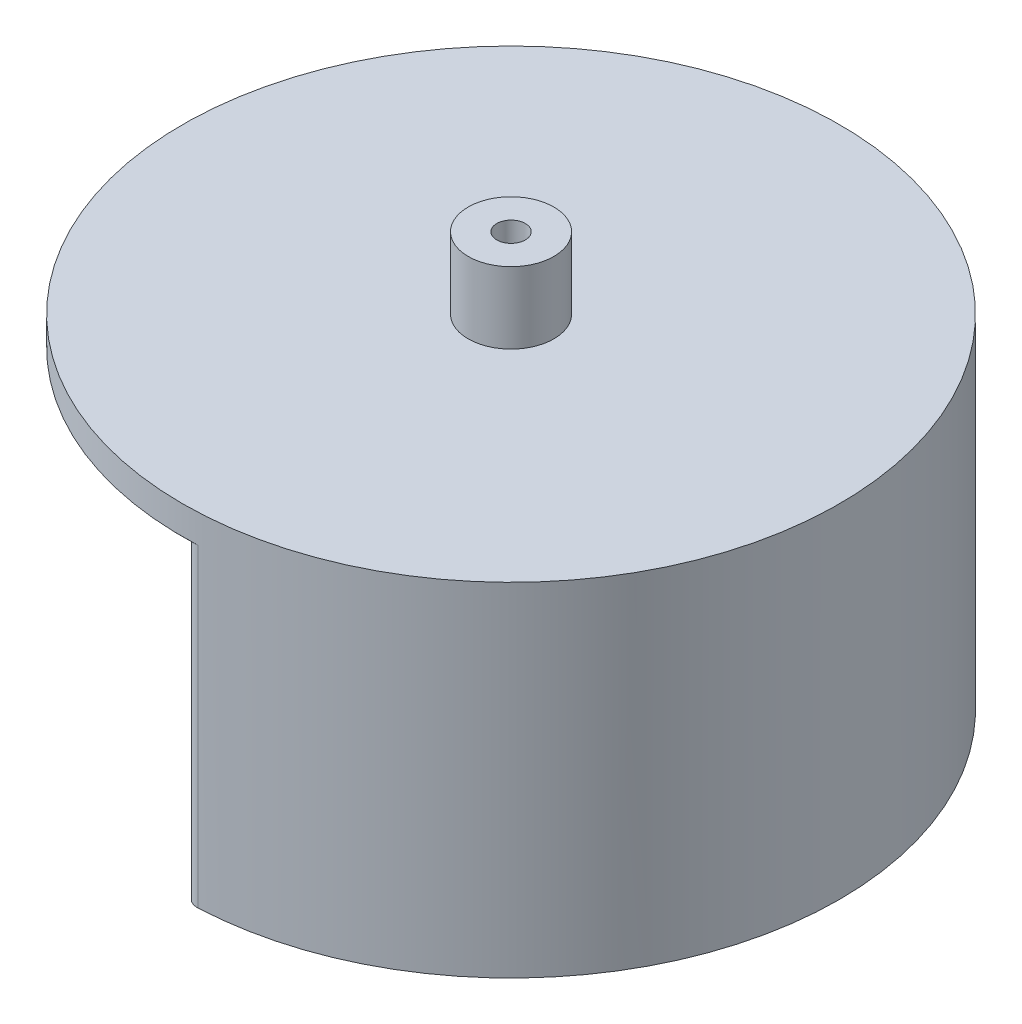
ISO-10303-21;
HEADER;
FILE_DESCRIPTION(('STEP AP214'),'2;1');
FILE_NAME('part.step','',(''),(''),'','','');
FILE_SCHEMA(('AUTOMOTIVE_DESIGN { 1 0 10303 214 1 1 1 1 }'));
ENDSEC;
DATA;
#1=APPLICATION_CONTEXT('core data for automotive mechanical design processes');
#2=APPLICATION_PROTOCOL_DEFINITION('international standard','automotive_design',2000,#1);
#3=PRODUCT_CONTEXT('',#1,'mechanical');
#4=PRODUCT('Part','Part','',(#3));
#5=PRODUCT_RELATED_PRODUCT_CATEGORY('part','',(#4));
#6=PRODUCT_DEFINITION_FORMATION('','',#4);
#7=PRODUCT_DEFINITION_CONTEXT('part definition',#1,'design');
#8=PRODUCT_DEFINITION('design','',#6,#7);
#9=PRODUCT_DEFINITION_SHAPE('','',#8);
#10=(LENGTH_UNIT() NAMED_UNIT(*) SI_UNIT(.MILLI.,.METRE.));
#11=(NAMED_UNIT(*) PLANE_ANGLE_UNIT() SI_UNIT($,.RADIAN.));
#12=(NAMED_UNIT(*) SI_UNIT($,.STERADIAN.) SOLID_ANGLE_UNIT());
#13=UNCERTAINTY_MEASURE_WITH_UNIT(LENGTH_MEASURE(1.E-05),#10,'distance_accuracy_value','');
#14=(GEOMETRIC_REPRESENTATION_CONTEXT(3) GLOBAL_UNCERTAINTY_ASSIGNED_CONTEXT((#13)) GLOBAL_UNIT_ASSIGNED_CONTEXT((#10,
#11,#12)) REPRESENTATION_CONTEXT('',''));
#15=CARTESIAN_POINT('',(0.,0.,0.));
#16=DIRECTION('',(0.,0.,1.));
#17=DIRECTION('',(1.,0.,0.));
#18=AXIS2_PLACEMENT_3D('',#15,#16,#17);
#19=CARTESIAN_POINT('',(0.,24.,0.));
#20=DIRECTION('',(0.,1.,0.));
#21=DIRECTION('',(0.,0.,1.));
#22=AXIS2_PLACEMENT_3D('',#19,#20,#21);
#23=PLANE('',#22);
#24=CARTESIAN_POINT('',(0.,24.,0.));
#25=DIRECTION('',(0.,1.,0.));
#26=DIRECTION('',(0.,0.,1.));
#27=AXIS2_PLACEMENT_3D('',#24,#25,#26);
#28=CIRCLE('',#27,23.);
#29=CARTESIAN_POINT('',(0.,24.,23.));
#30=VERTEX_POINT('',#29);
#31=EDGE_CURVE('E174',#30,#30,#28,.T.);
#32=ORIENTED_EDGE('',*,*,#31,.T.);
#33=EDGE_LOOP('',(#32));
#34=FACE_BOUND('',#33,.T.);
#35=CARTESIAN_POINT('',(0.,24.,0.));
#36=DIRECTION('',(0.,1.,0.));
#37=DIRECTION('',(0.,0.,1.));
#38=AXIS2_PLACEMENT_3D('',#35,#36,#37);
#39=CIRCLE('',#38,3.);
#40=CARTESIAN_POINT('',(0.,24.,3.));
#41=VERTEX_POINT('',#40);
#42=EDGE_CURVE('E273',#41,#41,#39,.T.);
#43=ORIENTED_EDGE('',*,*,#42,.F.);
#44=EDGE_LOOP('',(#43));
#45=FACE_BOUND('',#44,.T.);
#46=ADVANCED_FACE('F35',(#34,#45),#23,.T.);
#47=CARTESIAN_POINT('',(0.,0.,0.));
#48=DIRECTION('',(1.,0.,0.));
#49=DIRECTION('',(0.,0.,-1.));
#50=AXIS2_PLACEMENT_3D('',#47,#48,#49);
#51=PLANE('',#50);
#52=CARTESIAN_POINT('',(0.,1.,-2.));
#53=DIRECTION('',(1.,0.,0.));
#54=DIRECTION('',(0.,0.,-1.));
#55=AXIS2_PLACEMENT_3D('',#52,#53,#54);
#56=CIRCLE('',#55,1.);
#57=CARTESIAN_POINT('',(0.,0.,-2.));
#58=VERTEX_POINT('',#57);
#59=CARTESIAN_POINT('',(0.,0.0365669559977147,-1.73205080756888));
#60=VERTEX_POINT('',#59);
#61=EDGE_CURVE('E182',#58,#60,#56,.F.);
#62=ORIENTED_EDGE('',*,*,#61,.T.);
#63=DIRECTION('',(0.,1.,0.));
#64=VECTOR('',#63,1.);
#65=CARTESIAN_POINT('',(0.,0.,-1.73205080756888));
#66=LINE('',#65,#64);
#67=CARTESIAN_POINT('',(0.,2.82107760820556,-1.73205080756888));
#68=VERTEX_POINT('',#67);
#69=EDGE_CURVE('E66',#60,#68,#66,.T.);
#70=ORIENTED_EDGE('',*,*,#69,.T.);
#71=CARTESIAN_POINT('',(0.,3.78451065220791,-2.));
#72=DIRECTION('',(1.,0.,0.));
#73=DIRECTION('',(0.,0.,-1.));
#74=AXIS2_PLACEMENT_3D('',#71,#72,#73);
#75=CIRCLE('',#74,1.);
#76=CARTESIAN_POINT('',(0.,3.05315695058873,-2.68199836006249));
#77=VERTEX_POINT('',#76);
#78=EDGE_CURVE('E217',#68,#77,#75,.T.);
#79=ORIENTED_EDGE('',*,*,#78,.T.);
#80=DIRECTION('',(0.,0.681998360062494,-0.731353701619174));
#81=VECTOR('',#80,1.);
#82=CARTESIAN_POINT('',(0.,0.552153018834019,0.));
#83=LINE('',#82,#81);
#84=CARTESIAN_POINT('',(1.53466393152033E-13,21.0462804307853,-21.9772609758359));
#85=VERTEX_POINT('',#84);
#86=EDGE_CURVE('E164',#77,#85,#83,.T.);
#87=ORIENTED_EDGE('',*,*,#86,.T.);
#88=DIRECTION('',(0.,-1.,0.));
#89=VECTOR('',#88,1.);
#90=CARTESIAN_POINT('',(1.53466393152033E-13,0.,-21.9772609758359));
#91=LINE('',#90,#89);
#92=CARTESIAN_POINT('',(1.53466393152033E-13,0.,-21.9772609758359));
#93=VERTEX_POINT('',#92);
#94=EDGE_CURVE('E177',#85,#93,#91,.T.);
#95=ORIENTED_EDGE('',*,*,#94,.T.);
#96=DIRECTION('',(0.,0.,1.));
#97=VECTOR('',#96,1.);
#98=CARTESIAN_POINT('',(1.60608141586784E-13,0.,-23.));
#99=LINE('',#98,#97);
#100=EDGE_CURVE('E170',#93,#58,#99,.T.);
#101=ORIENTED_EDGE('',*,*,#100,.T.);
#102=EDGE_LOOP('',(#62,#70,#79,#87,#95,#101));
#103=FACE_BOUND('',#102,.T.);
#104=ADVANCED_FACE('F298',(#103),#51,.F.);
#105=CARTESIAN_POINT('',(0.,24.,0.));
#106=DIRECTION('',(0.,-1.,0.));
#107=DIRECTION('',(0.,0.,-1.));
#108=AXIS2_PLACEMENT_3D('',#105,#106,#107);
#109=CYLINDRICAL_SURFACE('',#108,23.);
#110=ORIENTED_EDGE('',*,*,#31,.F.);
#111=EDGE_LOOP('',(#110));
#112=FACE_BOUND('',#111,.T.);
#113=CARTESIAN_POINT('',(0.,22.,0.));
#114=DIRECTION('',(0.,1.,0.));
#115=DIRECTION('',(0.,0.,1.));
#116=AXIS2_PLACEMENT_3D('',#113,#114,#115);
#117=CIRCLE('',#116,23.);
#118=CARTESIAN_POINT('',(1.04545454545471,22.,-22.9762273838284));
#119=VERTEX_POINT('',#118);
#120=CARTESIAN_POINT('',(1.04545454545438,22.,22.9762273838285));
#121=VERTEX_POINT('',#120);
#122=EDGE_CURVE('E171',#119,#121,#117,.T.);
#123=ORIENTED_EDGE('',*,*,#122,.T.);
#124=DIRECTION('',(0.,-1.,0.));
#125=VECTOR('',#124,1.);
#126=CARTESIAN_POINT('',(1.04545454545439,24.,22.9762273838285));
#127=LINE('',#126,#125);
#128=CARTESIAN_POINT('',(1.04545454545438,0.,22.9762273838285));
#129=VERTEX_POINT('',#128);
#130=EDGE_CURVE('E212',#121,#129,#127,.T.);
#131=ORIENTED_EDGE('',*,*,#130,.T.);
#132=CARTESIAN_POINT('',(0.,0.,0.));
#133=DIRECTION('',(0.,1.,0.));
#134=DIRECTION('',(0.,0.,1.));
#135=AXIS2_PLACEMENT_3D('',#132,#133,#134);
#136=CIRCLE('',#135,23.);
#137=CARTESIAN_POINT('',(1.04545454545471,0.,-22.9762273838284));
#138=VERTEX_POINT('',#137);
#139=EDGE_CURVE('E173',#129,#138,#136,.T.);
#140=ORIENTED_EDGE('',*,*,#139,.T.);
#141=DIRECTION('',(0.,-1.,0.));
#142=VECTOR('',#141,1.);
#143=CARTESIAN_POINT('',(1.04545454545471,24.,-22.9762273838284));
#144=LINE('',#143,#142);
#145=EDGE_CURVE('E209',#138,#119,#144,.F.);
#146=ORIENTED_EDGE('',*,*,#145,.T.);
#147=EDGE_LOOP('',(#123,#131,#140,#146));
#148=FACE_BOUND('',#147,.T.);
#149=ADVANCED_FACE('F305',(#112,#148),#109,.T.);
#150=CARTESIAN_POINT('',(0.,0.,0.));
#151=DIRECTION('',(0.,1.,0.));
#152=DIRECTION('',(0.,0.,1.));
#153=AXIS2_PLACEMENT_3D('',#150,#151,#152);
#154=PLANE('',#153);
#155=CARTESIAN_POINT('',(0.,0.,2.));
#156=VERTEX_POINT('',#155);
#157=CARTESIAN_POINT('',(-1.53466393152033E-13,0.,21.9772609758359));
#158=VERTEX_POINT('',#157);
#159=EDGE_CURVE('E167',#156,#158,#99,.T.);
#160=ORIENTED_EDGE('',*,*,#159,.F.);
#161=CARTESIAN_POINT('',(0.,0.,0.));
#162=DIRECTION('',(0.,1.,0.));
#163=DIRECTION('',(0.,0.,1.));
#164=AXIS2_PLACEMENT_3D('',#161,#162,#163);
#165=CIRCLE('',#164,2.);
#166=CARTESIAN_POINT('',(2.00000000000008,0.,0.));
#167=VERTEX_POINT('',#166);
#168=EDGE_CURVE('E205',#156,#167,#165,.T.);
#169=ORIENTED_EDGE('',*,*,#168,.T.);
#170=DIRECTION('',(0.,0.,-1.));
#171=VECTOR('',#170,1.);
#172=CARTESIAN_POINT('',(2.00000000000001,0.,20.9045449603669));
#173=LINE('',#172,#171);
#174=CARTESIAN_POINT('',(2.00000000000001,0.,20.9045449603669));
#175=VERTEX_POINT('',#174);
#176=EDGE_CURVE('E154',#175,#167,#173,.T.);
#177=ORIENTED_EDGE('',*,*,#176,.F.);
#178=CARTESIAN_POINT('',(0.,0.,0.));
#179=DIRECTION('',(0.,-1.,0.));
#180=DIRECTION('',(0.,0.,-1.));
#181=AXIS2_PLACEMENT_3D('',#178,#179,#180);
#182=CIRCLE('',#181,21.);
#183=CARTESIAN_POINT('',(2.00000000000015,0.,-20.9045449603669));
#184=VERTEX_POINT('',#183);
#185=EDGE_CURVE('E158',#184,#175,#182,.T.);
#186=ORIENTED_EDGE('',*,*,#185,.F.);
#187=EDGE_CURVE('E151',#167,#184,#173,.T.);
#188=ORIENTED_EDGE('',*,*,#187,.F.);
#189=CARTESIAN_POINT('',(0.,0.,0.));
#190=DIRECTION('',(0.,1.,0.));
#191=DIRECTION('',(0.,0.,1.));
#192=AXIS2_PLACEMENT_3D('',#189,#190,#191);
#193=CIRCLE('',#192,2.);
#194=EDGE_CURVE('E203',#167,#58,#193,.T.);
#195=ORIENTED_EDGE('',*,*,#194,.T.);
#196=ORIENTED_EDGE('',*,*,#100,.F.);
#197=CARTESIAN_POINT('',(1.00000000000015,0.,-21.9772609758359));
#198=DIRECTION('',(0.,1.,0.));
#199=DIRECTION('',(0.,0.,1.));
#200=AXIS2_PLACEMENT_3D('',#197,#198,#199);
#201=CIRCLE('',#200,1.);
#202=EDGE_CURVE('E199',#93,#138,#201,.F.);
#203=ORIENTED_EDGE('',*,*,#202,.T.);
#204=ORIENTED_EDGE('',*,*,#139,.F.);
#205=CARTESIAN_POINT('',(0.999999999999846,0.,21.9772609758359));
#206=DIRECTION('',(0.,1.,0.));
#207=DIRECTION('',(0.,0.,1.));
#208=AXIS2_PLACEMENT_3D('',#205,#206,#207);
#209=CIRCLE('',#208,1.);
#210=EDGE_CURVE('E201',#129,#158,#209,.F.);
#211=ORIENTED_EDGE('',*,*,#210,.T.);
#212=EDGE_LOOP('',(#160,#169,#177,#186,#188,#195,#196,#203,#204,#211));
#213=FACE_BOUND('',#212,.T.);
#214=ADVANCED_FACE('F309',(#213),#154,.F.);
#215=CARTESIAN_POINT('',(0.,0.552153018834017,0.));
#216=DIRECTION('',(0.,1.,0.));
#217=DIRECTION('',(0.,0.,1.));
#218=AXIS2_PLACEMENT_3D('',#215,#216,#217);
#219=CONICAL_SURFACE('',#218,0.,0.82030474843734);
#220=ORIENTED_EDGE('',*,*,#86,.F.);
#221=CARTESIAN_POINT('',(0.,3.05315695058873,0.));
#222=DIRECTION('',(0.,-1.,0.));
#223=DIRECTION('',(0.,0.,-1.));
#224=AXIS2_PLACEMENT_3D('',#221,#222,#223);
#225=CIRCLE('',#224,2.68199836006249);
#226=CARTESIAN_POINT('',(0.,3.05315695058873,2.68199836006249));
#227=VERTEX_POINT('',#226);
#228=EDGE_CURVE('E207',#77,#227,#225,.F.);
#229=ORIENTED_EDGE('',*,*,#228,.T.);
#230=DIRECTION('',(0.,0.681998360062494,0.731353701619174));
#231=VECTOR('',#230,1.);
#232=CARTESIAN_POINT('',(0.,0.552153018834019,0.));
#233=LINE('',#232,#231);
#234=CARTESIAN_POINT('',(0.,21.0462804307853,21.9772609758359));
#235=VERTEX_POINT('',#234);
#236=EDGE_CURVE('E161',#227,#235,#233,.T.);
#237=ORIENTED_EDGE('',*,*,#236,.T.);
#238=CARTESIAN_POINT('',(-1.53466393152033E-13,21.0462804307853,21.9772609758359));
#239=CARTESIAN_POINT('',(4.98681147353923E-06,21.0749595209288,22.0080151188628));
#240=CARTESIAN_POINT('',(0.00141888735978594,21.1036285543426,22.0387593745985));
#241=CARTESIAN_POINT('',(0.00709598536114846,21.1608474584977,22.1001181848229));
#242=CARTESIAN_POINT('',(0.0113603419371365,21.1893972760062,22.130732681447));
#243=CARTESIAN_POINT('',(0.0285463070645687,21.2750413267984,22.222561880257));
#244=CARTESIAN_POINT('',(0.0458617528408751,21.3317668704956,22.2833726243246));
#245=CARTESIAN_POINT('',(0.0917221179187355,21.4407763191842,22.4001292949755));
#246=CARTESIAN_POINT('',(0.119812708735262,21.4931471194061,22.4561723217731));
#247=CARTESIAN_POINT('',(0.187815135661549,21.5942451777615,22.5641247218004));
#248=CARTESIAN_POINT('',(0.227697185540054,21.6429812337017,22.6160440974338));
#249=CARTESIAN_POINT('',(0.308272919302358,21.7232550701922,22.7011596942947));
#250=CARTESIAN_POINT('',(0.34622823197792,21.7560314695844,22.7357766458852));
#251=CARTESIAN_POINT('',(0.429229485649183,21.8172683589079,22.8000410448939));
#252=CARTESIAN_POINT('',(0.474268086315744,21.8457332575067,22.8296935719318));
#253=CARTESIAN_POINT('',(0.561580247838573,21.891809954313,22.877120816414));
#254=CARTESIAN_POINT('',(0.602657642558007,21.9104552827833,22.8960845794598));
#255=CARTESIAN_POINT('',(0.688567458150179,21.9430535334213,22.9286347344279));
#256=CARTESIAN_POINT('',(0.733391351047379,21.9570167683961,22.9422329563645));
#257=CARTESIAN_POINT('',(0.822219828088322,21.9785287183457,22.9622975075748));
#258=CARTESIAN_POINT('',(0.866011430573207,21.9864956611432,22.9692407622914));
#259=CARTESIAN_POINT('',(0.932688563381891,21.9945532944344,22.9752463279393));
#260=CARTESIAN_POINT('',(0.955168492775636,21.9965906087455,22.9765095047355));
#261=CARTESIAN_POINT('',(1.00025806425097,21.9993154991922,22.9775156875719));
#262=CARTESIAN_POINT('',(1.02286778058138,22.0000022047536,22.977257713538));
#263=CARTESIAN_POINT('',(1.04545454545439,22.,22.9762273838285));
#264=B_SPLINE_CURVE_WITH_KNOTS('',3,(#238,#239,#240,#241,#242,#243,#244,#245,#246,#247,#248,
#249,#250,#251,#252,#253,#254,#255,#256,#257,#258,#259,#260,#261,#262,#263),.UNSPECIFIED.,.F.,
.F.,(4,2,2,2,2,2,2,2,2,2,2,2,4),(0.,0.126100842148268,0.252252993760631,0.506142330249706,
0.75033116844514,0.993908359682158,1.17609047545475,1.35808502712596,1.50431210845778,
1.65021496039483,1.78463909663643,1.85237945061899,1.92016345432265),.UNSPECIFIED.);
#265=EDGE_CURVE('E50',#235,#121,#264,.T.);
#266=ORIENTED_EDGE('',*,*,#265,.T.);
#267=ORIENTED_EDGE('',*,*,#122,.F.);
#268=CARTESIAN_POINT('',(1.04545454545471,22.,-22.9762273838284));
#269=CARTESIAN_POINT('',(1.02236636157387,22.0000022673743,-22.977280610193));
#270=CARTESIAN_POINT('',(0.999254989577084,21.9992846994125,-22.9775267623061));
#271=CARTESIAN_POINT('',(0.953171647694061,21.9964381662689,-22.9764293033596));
#272=CARTESIAN_POINT('',(0.930199598335138,21.9943101010987,-22.9750867056227));
#273=CARTESIAN_POINT('',(0.862101325416662,21.985897434399,-22.9687476663178));
#274=CARTESIAN_POINT('',(0.817408403034712,21.9775832999316,-22.9614562518742));
#275=CARTESIAN_POINT('',(0.730674887857498,21.9561085388392,-22.9413396206805));
#276=CARTESIAN_POINT('',(0.688628744559864,21.9429584789815,-22.9285264588452));
#277=CARTESIAN_POINT('',(0.60781637043848,21.9125240180856,-22.8981628307409));
#278=CARTESIAN_POINT('',(0.569056650576691,21.8952316581487,-22.8806032363665));
#279=CARTESIAN_POINT('',(0.482393649671455,21.8505877851124,-22.834733252091));
#280=CARTESIAN_POINT('',(0.436063954737335,21.8218368388016,-22.8048133703602));
#281=CARTESIAN_POINT('',(0.350748510544365,21.7597825373849,-22.7397324914005));
#282=CARTESIAN_POINT('',(0.311773958283083,21.7264723725016,-22.7045636469288));
#283=CARTESIAN_POINT('',(0.229526405096815,21.6451398652403,-22.6183421626354));
#284=CARTESIAN_POINT('',(0.189003859111748,21.5958646437589,-22.5658522481651));
#285=CARTESIAN_POINT('',(0.120017374971551,21.4935968011365,-22.4566541946875));
#286=CARTESIAN_POINT('',(0.0915826028677478,21.4405955443391,-22.3999362368785));
#287=CARTESIAN_POINT('',(0.0456298372162634,21.3310588116444,-22.2826136561213));
#288=CARTESIAN_POINT('',(0.0284013547033143,21.2744681911273,-22.2219474163139));
#289=CARTESIAN_POINT('',(0.0113024448695886,21.1890337481401,-22.1303428711939));
#290=CARTESIAN_POINT('',(0.00705987289883921,21.1605562775222,-22.0998059414894));
#291=CARTESIAN_POINT('',(0.00141166111094863,21.1034825980495,-22.0386028539324));
#292=CARTESIAN_POINT('',(4.91222205888712E-06,21.0748864399989,-22.0079367513025));
#293=CARTESIAN_POINT('',(1.53495844685007E-13,21.0462804307853,-21.9772609758359));
#294=B_SPLINE_CURVE_WITH_KNOTS('',3,(#268,#269,#270,#271,#272,#273,#274,#275,#276,#277,#278,
#279,#280,#281,#282,#283,#284,#285,#286,#287,#288,#289,#290,#291,#292,#293),.UNSPECIFIED.,.F.,
.F.,(4,2,2,2,2,2,2,2,2,2,2,2,4),(0.,0.0692856661146644,0.138527164854294,0.275872804934863,
0.412920103179858,0.550232862665501,0.735801175075706,0.921649745310012,1.1681701715814,
1.41528208557481,1.66854815630028,1.79437753898307,1.92015770106746),.UNSPECIFIED.);
#295=EDGE_CURVE('E12',#119,#85,#294,.T.);
#296=ORIENTED_EDGE('',*,*,#295,.T.);
#297=EDGE_LOOP('',(#220,#229,#237,#266,#267,#296));
#298=FACE_BOUND('',#297,.T.);
#299=ADVANCED_FACE('F228',(#298),#219,.T.);
#300=ORIENTED_EDGE('',*,*,#236,.F.);
#301=CARTESIAN_POINT('',(0.,3.78451065220791,2.));
#302=DIRECTION('',(1.,0.,0.));
#303=DIRECTION('',(0.,0.,-1.));
#304=AXIS2_PLACEMENT_3D('',#301,#302,#303);
#305=CIRCLE('',#304,1.);
#306=CARTESIAN_POINT('',(0.,2.82107760820556,1.73205080756888));
#307=VERTEX_POINT('',#306);
#308=EDGE_CURVE('E215',#227,#307,#305,.T.);
#309=ORIENTED_EDGE('',*,*,#308,.T.);
#310=DIRECTION('',(0.,1.,0.));
#311=VECTOR('',#310,1.);
#312=CARTESIAN_POINT('',(0.,0.,1.73205080756888));
#313=LINE('',#312,#311);
#314=CARTESIAN_POINT('',(0.,0.0365669559977147,1.73205080756888));
#315=VERTEX_POINT('',#314);
#316=EDGE_CURVE('E58',#307,#315,#313,.F.);
#317=ORIENTED_EDGE('',*,*,#316,.T.);
#318=CARTESIAN_POINT('',(0.,1.,2.));
#319=DIRECTION('',(1.,0.,0.));
#320=DIRECTION('',(0.,0.,-1.));
#321=AXIS2_PLACEMENT_3D('',#318,#319,#320);
#322=CIRCLE('',#321,1.);
#323=EDGE_CURVE('E196',#315,#156,#322,.F.);
#324=ORIENTED_EDGE('',*,*,#323,.T.);
#325=ORIENTED_EDGE('',*,*,#159,.T.);
#326=DIRECTION('',(0.,-1.,0.));
#327=VECTOR('',#326,1.);
#328=CARTESIAN_POINT('',(-1.53466393152033E-13,0.,21.9772609758359));
#329=LINE('',#328,#327);
#330=EDGE_CURVE('E194',#158,#235,#329,.F.);
#331=ORIENTED_EDGE('',*,*,#330,.T.);
#332=EDGE_LOOP('',(#300,#309,#317,#324,#325,#331));
#333=FACE_BOUND('',#332,.T.);
#334=ADVANCED_FACE('F306',(#333),#51,.F.);
#335=CARTESIAN_POINT('',(0.,22.,0.));
#336=DIRECTION('',(0.,1.,0.));
#337=DIRECTION('',(0.,0.,1.));
#338=AXIS2_PLACEMENT_3D('',#335,#336,#337);
#339=PLANE('',#338);
#340=CARTESIAN_POINT('',(0.,22.,0.));
#341=DIRECTION('',(0.,1.,0.));
#342=DIRECTION('',(0.,0.,1.));
#343=AXIS2_PLACEMENT_3D('',#340,#341,#342);
#344=CIRCLE('',#343,21.);
#345=CARTESIAN_POINT('',(2.00000000000015,22.,-20.9045449603669));
#346=VERTEX_POINT('',#345);
#347=CARTESIAN_POINT('',(2.00000000000001,22.,20.9045449603669));
#348=VERTEX_POINT('',#347);
#349=EDGE_CURVE('E136',#346,#348,#344,.F.);
#350=ORIENTED_EDGE('',*,*,#349,.T.);
#351=DIRECTION('',(0.,0.,-1.));
#352=VECTOR('',#351,1.);
#353=CARTESIAN_POINT('',(2.00000000000001,22.,20.9045449603669));
#354=LINE('',#353,#352);
#355=EDGE_CURVE('E148',#348,#346,#354,.T.);
#356=ORIENTED_EDGE('',*,*,#355,.T.);
#357=EDGE_LOOP('',(#350,#356));
#358=FACE_BOUND('',#357,.T.);
#359=ADVANCED_FACE('F153',(#358),#339,.F.);
#360=CARTESIAN_POINT('',(2.00000000000001,69.9238500128201,20.9045449603669));
#361=DIRECTION('',(-1.,0.,0.));
#362=DIRECTION('',(0.,0.,1.));
#363=AXIS2_PLACEMENT_3D('',#360,#361,#362);
#364=PLANE('',#363);
#365=DIRECTION('',(0.,-1.,0.));
#366=VECTOR('',#365,1.);
#367=CARTESIAN_POINT('',(2.00000000000001,69.9238500128201,20.9045449603669));
#368=LINE('',#367,#366);
#369=EDGE_CURVE('E142',#348,#175,#368,.T.);
#370=ORIENTED_EDGE('',*,*,#369,.T.);
#371=ORIENTED_EDGE('',*,*,#176,.T.);
#372=ORIENTED_EDGE('',*,*,#187,.T.);
#373=DIRECTION('',(0.,-1.,0.));
#374=VECTOR('',#373,1.);
#375=CARTESIAN_POINT('',(2.00000000000015,69.9238500128201,-20.9045449603669));
#376=LINE('',#375,#374);
#377=EDGE_CURVE('E140',#346,#184,#376,.T.);
#378=ORIENTED_EDGE('',*,*,#377,.F.);
#379=ORIENTED_EDGE('',*,*,#355,.F.);
#380=EDGE_LOOP('',(#370,#371,#372,#378,#379));
#381=FACE_BOUND('',#380,.T.);
#382=ADVANCED_FACE('F147',(#381),#364,.F.);
#383=CARTESIAN_POINT('',(0.,69.9238500128201,0.));
#384=DIRECTION('',(0.,-1.,0.));
#385=DIRECTION('',(0.,0.,-1.));
#386=AXIS2_PLACEMENT_3D('',#383,#384,#385);
#387=CYLINDRICAL_SURFACE('',#386,21.);
#388=ORIENTED_EDGE('',*,*,#377,.T.);
#389=ORIENTED_EDGE('',*,*,#185,.T.);
#390=ORIENTED_EDGE('',*,*,#369,.F.);
#391=ORIENTED_EDGE('',*,*,#349,.F.);
#392=EDGE_LOOP('',(#388,#389,#390,#391));
#393=FACE_BOUND('',#392,.T.);
#394=ADVANCED_FACE('F138',(#393),#387,.F.);
#395=CARTESIAN_POINT('',(0.,0.,0.));
#396=DIRECTION('',(0.,1.,0.));
#397=DIRECTION('',(0.,0.,1.));
#398=AXIS2_PLACEMENT_3D('',#395,#396,#397);
#399=CYLINDRICAL_SURFACE('',#398,1.);
#400=DIRECTION('',(0.,1.,0.));
#401=VECTOR('',#400,1.);
#402=CARTESIAN_POINT('',(0.500000000000006,0.,-0.866025403784435));
#403=LINE('',#402,#401);
#404=CARTESIAN_POINT('',(0.500000000000006,3.78451065220791,-0.866025403784435));
#405=VERTEX_POINT('',#404);
#406=CARTESIAN_POINT('',(0.500000000000006,1.,-0.866025403784435));
#407=VERTEX_POINT('',#406);
#408=EDGE_CURVE('E189',#405,#407,#403,.F.);
#409=ORIENTED_EDGE('',*,*,#408,.T.);
#410=CARTESIAN_POINT('',(0.,1.,0.));
#411=DIRECTION('',(0.,1.,0.));
#412=DIRECTION('',(0.,0.,1.));
#413=AXIS2_PLACEMENT_3D('',#410,#411,#412);
#414=CIRCLE('',#413,1.);
#415=CARTESIAN_POINT('',(0.499999999999994,1.,0.866025403784442));
#416=VERTEX_POINT('',#415);
#417=EDGE_CURVE('E192',#407,#416,#414,.F.);
#418=ORIENTED_EDGE('',*,*,#417,.T.);
#419=DIRECTION('',(0.,1.,0.));
#420=VECTOR('',#419,1.);
#421=CARTESIAN_POINT('',(0.499999999999994,0.,0.866025403784442));
#422=LINE('',#421,#420);
#423=CARTESIAN_POINT('',(0.499999999999994,3.78451065220791,0.866025403784442));
#424=VERTEX_POINT('',#423);
#425=EDGE_CURVE('E187',#416,#424,#422,.T.);
#426=ORIENTED_EDGE('',*,*,#425,.T.);
#427=CARTESIAN_POINT('',(0.,3.78451065220791,0.));
#428=DIRECTION('',(0.,-1.,0.));
#429=DIRECTION('',(0.,0.,-1.));
#430=AXIS2_PLACEMENT_3D('',#427,#428,#429);
#431=CIRCLE('',#430,1.);
#432=EDGE_CURVE('E185',#424,#405,#431,.T.);
#433=ORIENTED_EDGE('',*,*,#432,.T.);
#434=EDGE_LOOP('',(#409,#418,#426,#433));
#435=FACE_BOUND('',#434,.T.);
#436=CARTESIAN_POINT('',(0.,29.,0.));
#437=DIRECTION('',(0.,1.,0.));
#438=DIRECTION('',(0.,0.,1.));
#439=AXIS2_PLACEMENT_3D('',#436,#437,#438);
#440=CIRCLE('',#439,1.);
#441=CARTESIAN_POINT('',(0.,29.,1.));
#442=VERTEX_POINT('',#441);
#443=EDGE_CURVE('E278',#442,#442,#440,.T.);
#444=ORIENTED_EDGE('',*,*,#443,.T.);
#445=EDGE_LOOP('',(#444));
#446=FACE_BOUND('',#445,.T.);
#447=ADVANCED_FACE('F241',(#435,#446),#399,.F.);
#448=CARTESIAN_POINT('',(0.999999999999988,0.,1.73205080756888));
#449=DIRECTION('',(0.,1.,0.));
#450=DIRECTION('',(0.,0.,1.));
#451=AXIS2_PLACEMENT_3D('',#448,#449,#450);
#452=CYLINDRICAL_SURFACE('',#451,1.);
#453=CARTESIAN_POINT('',(0.,2.82107760820556,1.73205080756888));
#454=CARTESIAN_POINT('',(-3.88469592593282E-06,2.82787814865803,1.70757825236041));
#455=CARTESIAN_POINT('',(0.000898544380149253,2.83561603684061,1.68339013467794));
#456=CARTESIAN_POINT('',(0.00435730824803538,2.85284145734694,1.63581222239075));
#457=CARTESIAN_POINT('',(0.00691078070920277,2.86232594137195,1.61242111978148));
#458=CARTESIAN_POINT('',(0.0167171833114631,2.8929454890476,1.54434362806303));
#459=CARTESIAN_POINT('',(0.0261259744938189,2.91645632130051,1.50101428990672));
#460=CARTESIAN_POINT('',(0.0518993895626203,2.97443969014634,1.4098171775599));
#461=CARTESIAN_POINT('',(0.0693469335843974,3.01018745752935,1.3630902321934));
#462=CARTESIAN_POINT('',(0.1085886306105,3.08739955593118,1.27634093735466));
#463=CARTESIAN_POINT('',(0.130408894189079,3.12889774134511,1.23636165690598));
#464=CARTESIAN_POINT('',(0.172849183696587,3.20834310745026,1.16890963592356));
#465=CARTESIAN_POINT('',(0.193050890029199,3.24570865336777,1.14046480846266));
#466=CARTESIAN_POINT('',(0.23483037421114,3.32232828403987,1.08733478777724));
#467=CARTESIAN_POINT('',(0.256409265132222,3.36158388992697,1.062652691695));
#468=CARTESIAN_POINT('',(0.300650261046878,3.44134665286608,1.016558029119));
#469=CARTESIAN_POINT('',(0.32331214322918,3.48185355187969,0.995144793869972));
#470=CARTESIAN_POINT('',(0.369643489546532,3.56364097548603,0.955142096068406));
#471=CARTESIAN_POINT('',(0.393312491003234,3.60492114005816,0.936551354395205));
#472=CARTESIAN_POINT('',(0.430422695629651,3.66848674235188,0.90996051141753));
#473=CARTESIAN_POINT('',(0.443474600118509,3.69063382270085,0.901071145493809));
#474=CARTESIAN_POINT('',(0.469904109197348,3.73496925088425,0.883966989486656));
#475=CARTESIAN_POINT('',(0.483281445006366,3.75715755155984,0.875751665683894));
#476=CARTESIAN_POINT('',(0.497892930479455,3.78106800598537,0.867244491183334));
#477=CARTESIAN_POINT('',(0.498945913458952,3.78278933327561,0.866633985841754));
#478=CARTESIAN_POINT('',(0.499999999999994,3.78451065220791,0.866025403784442));
#479=B_SPLINE_CURVE_WITH_KNOTS('',3,(#453,#454,#455,#456,#457,#458,#459,#460,#461,#462,#463,
#464,#465,#466,#467,#468,#469,#470,#471,#472,#473,#474,#475,#476,#477,#478),.UNSPECIFIED.,.F.,
.F.,(4,2,2,2,2,2,2,2,2,2,2,2,4),(0.,0.076125987145936,0.152120351086333,0.301844361084004,
0.484938343191458,0.669160074347852,0.822309527156834,0.975584365999293,1.12882780517973,
1.28200158760414,1.36359512650705,1.44512342173428,1.45144798056262),.UNSPECIFIED.);
#480=EDGE_CURVE('E245',#424,#307,#479,.F.);
#481=ORIENTED_EDGE('',*,*,#480,.F.);
#482=ORIENTED_EDGE('',*,*,#425,.F.);
#483=CARTESIAN_POINT('',(0.,0.0365669559977147,1.73205080756888));
#484=CARTESIAN_POINT('',(-3.88469592551939E-06,0.0433674964501527,1.7075782523604));
#485=CARTESIAN_POINT('',(0.000898544380150082,0.0511053846327165,1.68339013467793));
#486=CARTESIAN_POINT('',(0.00435730824803695,0.0683308051390339,1.63581222239074));
#487=CARTESIAN_POINT('',(0.00691078070920462,0.0778152891640502,1.61242111978147));
#488=CARTESIAN_POINT('',(0.0167171833114656,0.108434836839702,1.54434362806302));
#489=CARTESIAN_POINT('',(0.0261259744938217,0.131945669092607,1.50101428990671));
#490=CARTESIAN_POINT('',(0.0518993895626241,0.189929037938438,1.40981717755989));
#491=CARTESIAN_POINT('',(0.0693469335844022,0.225676805321453,1.36309023219339));
#492=CARTESIAN_POINT('',(0.108588630610506,0.302888903723288,1.27634093735464));
#493=CARTESIAN_POINT('',(0.130408894189086,0.344387089137214,1.23636165690597));
#494=CARTESIAN_POINT('',(0.172849183696594,0.423832455242368,1.16890963592355));
#495=CARTESIAN_POINT('',(0.193050890029207,0.461198001159874,1.14046480846265));
#496=CARTESIAN_POINT('',(0.234830374211149,0.537817631831982,1.08733478777723));
#497=CARTESIAN_POINT('',(0.256409265132232,0.577073237719079,1.06265269169499));
#498=CARTESIAN_POINT('',(0.300650261046888,0.656836000658194,1.01655802911899));
#499=CARTESIAN_POINT('',(0.323312143229189,0.697342899671808,0.995144793869962));
#500=CARTESIAN_POINT('',(0.369643489546548,0.77913032327815,0.955142096068394));
#501=CARTESIAN_POINT('',(0.393312491003258,0.820410487850269,0.936551354395188));
#502=CARTESIAN_POINT('',(0.430422695629657,0.883976090144003,0.909960511417525));
#503=CARTESIAN_POINT('',(0.443474600118501,0.906123170492978,0.901071145493813));
#504=CARTESIAN_POINT('',(0.469904109197369,0.950458598676337,0.883966989486643));
#505=CARTESIAN_POINT('',(0.48328144500643,0.972646899351888,0.875751665683856));
#506=CARTESIAN_POINT('',(0.497892930479464,0.996557353777457,0.867244491183329));
#507=CARTESIAN_POINT('',(0.498945913458957,0.998278681067701,0.866633985841752));
#508=CARTESIAN_POINT('',(0.499999999999994,1.,0.866025403784442));
#509=B_SPLINE_CURVE_WITH_KNOTS('',3,(#483,#484,#485,#486,#487,#488,#489,#490,#491,#492,#493,
#494,#495,#496,#497,#498,#499,#500,#501,#502,#503,#504,#505,#506,#507,#508),.UNSPECIFIED.,.F.,
.F.,(4,2,2,2,2,2,2,2,2,2,2,2,4),(0.,0.0761259871459361,0.152120351086331,0.301844361084,
0.484938343191458,0.669160074347853,0.822309527156837,0.975584365999298,1.12882780517974,
1.28200158760416,1.36359512650705,1.44512342173427,1.4514479805626),.UNSPECIFIED.);
#510=EDGE_CURVE('E40',#315,#416,#509,.T.);
#511=ORIENTED_EDGE('',*,*,#510,.F.);
#512=ORIENTED_EDGE('',*,*,#316,.F.);
#513=EDGE_LOOP('',(#481,#482,#511,#512));
#514=FACE_BOUND('',#513,.T.);
#515=ADVANCED_FACE('F237',(#514),#452,.T.);
#516=CARTESIAN_POINT('',(0.,1.,0.));
#517=DIRECTION('',(0.,1.,0.));
#518=DIRECTION('',(0.,0.,1.));
#519=AXIS2_PLACEMENT_3D('',#516,#517,#518);
#520=TOROIDAL_SURFACE('',#519,2.,1.);
#521=ORIENTED_EDGE('',*,*,#510,.T.);
#522=ORIENTED_EDGE('',*,*,#417,.F.);
#523=CARTESIAN_POINT('',(0.,0.0365669559977147,-1.73205080756888));
#524=CARTESIAN_POINT('',(-3.88469590168312E-06,0.0433674964501524,-1.7075782523604));
#525=CARTESIAN_POINT('',(0.000898544380173524,0.051105384632716,-1.68339013467793));
#526=CARTESIAN_POINT('',(0.00435730824805952,0.0683308051390327,-1.63581222239074));
#527=CARTESIAN_POINT('',(0.00691078070922674,0.0778152891640487,-1.61242111978147));
#528=CARTESIAN_POINT('',(0.0167171833114866,0.108434836839701,-1.54434362806303));
#529=CARTESIAN_POINT('',(0.0261259744938423,0.131945669092606,-1.50101428990671));
#530=CARTESIAN_POINT('',(0.0518993895626441,0.189929037938439,-1.40981717755989));
#531=CARTESIAN_POINT('',(0.0693469335844221,0.225676805321455,-1.36309023219339));
#532=CARTESIAN_POINT('',(0.108588630610525,0.30288890372329,-1.27634093735464));
#533=CARTESIAN_POINT('',(0.130408894189104,0.344387089137215,-1.23636165690597));
#534=CARTESIAN_POINT('',(0.17284918369661,0.423832455242367,-1.16890963592355));
#535=CARTESIAN_POINT('',(0.193050890029221,0.461198001159872,-1.14046480846265));
#536=CARTESIAN_POINT('',(0.234830374211163,0.537817631831977,-1.08733478777723));
#537=CARTESIAN_POINT('',(0.256409265132246,0.577073237719072,-1.06265269169499));
#538=CARTESIAN_POINT('',(0.300650261046898,0.65683600065819,-1.01655802911899));
#539=CARTESIAN_POINT('',(0.323312143229196,0.697342899671809,-0.995144793869963));
#540=CARTESIAN_POINT('',(0.369643489546565,0.779130323278143,-0.955142096068386));
#541=CARTESIAN_POINT('',(0.39331249100329,0.820410487850252,-0.936551354395171));
#542=CARTESIAN_POINT('',(0.430422695629662,0.883976090144009,-0.909960511417524));
#543=CARTESIAN_POINT('',(0.443474600118488,0.906123170492999,-0.901071145493822));
#544=CARTESIAN_POINT('',(0.469904109197409,0.950458598676315,-0.88396698948662));
#545=CARTESIAN_POINT('',(0.483281445006542,0.972646899351806,-0.875751665683791));
#546=CARTESIAN_POINT('',(0.497892930479492,0.996557353777445,-0.867244491183313));
#547=CARTESIAN_POINT('',(0.498945913458978,0.998278681067695,-0.86663398584174));
#548=CARTESIAN_POINT('',(0.500000000000006,1.,-0.866025403784435));
#549=B_SPLINE_CURVE_WITH_KNOTS('',3,(#523,#524,#525,#526,#527,#528,#529,#530,#531,#532,#533,
#534,#535,#536,#537,#538,#539,#540,#541,#542,#543,#544,#545,#546,#547,#548),.UNSPECIFIED.,.F.,
.F.,(4,2,2,2,2,2,2,2,2,2,2,2,4),(0.,0.0761259871459333,0.152120351086326,0.301844361084,
0.484938343191462,0.669160074347852,0.822309527156832,0.97558436599929,1.12882780517974,
1.28200158760416,1.36359512650705,1.44512342173427,1.4514479805626),.UNSPECIFIED.);
#550=EDGE_CURVE('E251',#60,#407,#549,.T.);
#551=ORIENTED_EDGE('',*,*,#550,.F.);
#552=ORIENTED_EDGE('',*,*,#61,.F.);
#553=ORIENTED_EDGE('',*,*,#194,.F.);
#554=ORIENTED_EDGE('',*,*,#168,.F.);
#555=ORIENTED_EDGE('',*,*,#323,.F.);
#556=EDGE_LOOP('',(#521,#522,#551,#552,#553,#554,#555));
#557=FACE_BOUND('',#556,.T.);
#558=ADVANCED_FACE('F240',(#557),#520,.T.);
#559=CARTESIAN_POINT('',(0.,3.78451065220791,0.));
#560=DIRECTION('',(0.,-1.,0.));
#561=DIRECTION('',(0.,0.,-1.));
#562=AXIS2_PLACEMENT_3D('',#559,#560,#561);
#563=TOROIDAL_SURFACE('',#562,2.,1.);
#564=ORIENTED_EDGE('',*,*,#228,.F.);
#565=ORIENTED_EDGE('',*,*,#78,.F.);
#566=CARTESIAN_POINT('',(0.,2.82107760820556,-1.73205080756888));
#567=CARTESIAN_POINT('',(-3.8846959019014E-06,2.82787814865803,-1.70757825236041));
#568=CARTESIAN_POINT('',(0.000898544380172893,2.83561603684061,-1.68339013467795));
#569=CARTESIAN_POINT('',(0.00435730824805798,2.85284145734694,-1.63581222239076));
#570=CARTESIAN_POINT('',(0.00691078070922473,2.86232594137195,-1.61242111978149));
#571=CARTESIAN_POINT('',(0.0167171833114837,2.8929454890476,-1.54434362806304));
#572=CARTESIAN_POINT('',(0.0261259744938393,2.9164563213005,-1.50101428990672));
#573=CARTESIAN_POINT('',(0.0518993895626406,2.97443969014634,-1.4098171775599));
#574=CARTESIAN_POINT('',(0.0693469335844179,3.01018745752935,-1.3630902321934));
#575=CARTESIAN_POINT('',(0.108588630610519,3.08739955593119,-1.27634093735465));
#576=CARTESIAN_POINT('',(0.130408894189098,3.12889774134511,-1.23636165690598));
#577=CARTESIAN_POINT('',(0.172849183696603,3.20834310745026,-1.16890963592356));
#578=CARTESIAN_POINT('',(0.193050890029214,3.24570865336776,-1.14046480846266));
#579=CARTESIAN_POINT('',(0.234830374211154,3.32232828403987,-1.08733478777724));
#580=CARTESIAN_POINT('',(0.256409265132236,3.36158388992696,-1.062652691695));
#581=CARTESIAN_POINT('',(0.300650261046887,3.44134665286608,-1.016558029119));
#582=CARTESIAN_POINT('',(0.323312143229186,3.48185355187969,-0.995144793869973));
#583=CARTESIAN_POINT('',(0.369643489546551,3.56364097548603,-0.955142096068398));
#584=CARTESIAN_POINT('',(0.393312491003271,3.60492114005814,-0.936551354395185));
#585=CARTESIAN_POINT('',(0.43042269562965,3.66848674235189,-0.909960511417532));
#586=CARTESIAN_POINT('',(0.443474600118482,3.69063382270089,-0.901071145493826));
#587=CARTESIAN_POINT('',(0.469904109197402,3.73496925088421,-0.883966989486625));
#588=CARTESIAN_POINT('',(0.483281445006526,3.75715755155972,-0.875751665683799));
#589=CARTESIAN_POINT('',(0.49789293047949,3.78106800598535,-0.867244491183314));
#590=CARTESIAN_POINT('',(0.498945913458977,3.7827893332756,-0.866633985841741));
#591=CARTESIAN_POINT('',(0.500000000000006,3.78451065220791,-0.866025403784435));
#592=B_SPLINE_CURVE_WITH_KNOTS('',3,(#566,#567,#568,#569,#570,#571,#572,#573,#574,#575,#576,
#577,#578,#579,#580,#581,#582,#583,#584,#585,#586,#587,#588,#589,#590,#591),.UNSPECIFIED.,.F.,
.F.,(4,2,2,2,2,2,2,2,2,2,2,2,4),(0.,0.0761259871459323,0.152120351086326,0.301844361084004,
0.484938343191465,0.669160074347852,0.822309527156829,0.975584365999283,1.12882780517972,
1.28200158760414,1.36359512650706,1.44512342173428,1.45144798056262),.UNSPECIFIED.);
#593=EDGE_CURVE('E263',#405,#68,#592,.F.);
#594=ORIENTED_EDGE('',*,*,#593,.F.);
#595=ORIENTED_EDGE('',*,*,#432,.F.);
#596=ORIENTED_EDGE('',*,*,#480,.T.);
#597=ORIENTED_EDGE('',*,*,#308,.F.);
#598=EDGE_LOOP('',(#564,#565,#594,#595,#596,#597));
#599=FACE_BOUND('',#598,.T.);
#600=ADVANCED_FACE('F256',(#599),#563,.T.);
#601=CARTESIAN_POINT('',(1.00000000000001,0.,-1.73205080756887));
#602=DIRECTION('',(0.,1.,0.));
#603=DIRECTION('',(0.,0.,1.));
#604=AXIS2_PLACEMENT_3D('',#601,#602,#603);
#605=CYLINDRICAL_SURFACE('',#604,1.);
#606=ORIENTED_EDGE('',*,*,#550,.T.);
#607=ORIENTED_EDGE('',*,*,#408,.F.);
#608=ORIENTED_EDGE('',*,*,#593,.T.);
#609=ORIENTED_EDGE('',*,*,#69,.F.);
#610=EDGE_LOOP('',(#606,#607,#608,#609));
#611=FACE_BOUND('',#610,.T.);
#612=ADVANCED_FACE('F235',(#611),#605,.T.);
#613=CARTESIAN_POINT('',(0.999999999999846,24.,21.9772609758359));
#614=DIRECTION('',(0.,-1.,0.));
#615=DIRECTION('',(0.,0.,-1.));
#616=AXIS2_PLACEMENT_3D('',#613,#614,#615);
#617=CYLINDRICAL_SURFACE('',#616,1.);
#618=ORIENTED_EDGE('',*,*,#265,.F.);
#619=ORIENTED_EDGE('',*,*,#330,.F.);
#620=ORIENTED_EDGE('',*,*,#210,.F.);
#621=ORIENTED_EDGE('',*,*,#130,.F.);
#622=EDGE_LOOP('',(#618,#619,#620,#621));
#623=FACE_BOUND('',#622,.T.);
#624=ADVANCED_FACE('F232',(#623),#617,.T.);
#625=CARTESIAN_POINT('',(1.00000000000015,24.,-21.9772609758359));
#626=DIRECTION('',(0.,-1.,0.));
#627=DIRECTION('',(0.,0.,-1.));
#628=AXIS2_PLACEMENT_3D('',#625,#626,#627);
#629=CYLINDRICAL_SURFACE('',#628,1.);
#630=ORIENTED_EDGE('',*,*,#295,.F.);
#631=ORIENTED_EDGE('',*,*,#145,.F.);
#632=ORIENTED_EDGE('',*,*,#202,.F.);
#633=ORIENTED_EDGE('',*,*,#94,.F.);
#634=EDGE_LOOP('',(#630,#631,#632,#633));
#635=FACE_BOUND('',#634,.T.);
#636=ADVANCED_FACE('F37',(#635),#629,.T.);
#637=CARTESIAN_POINT('',(0.,29.,0.));
#638=DIRECTION('',(0.,1.,0.));
#639=DIRECTION('',(0.,0.,1.));
#640=AXIS2_PLACEMENT_3D('',#637,#638,#639);
#641=PLANE('',#640);
#642=CARTESIAN_POINT('',(0.,29.,0.));
#643=DIRECTION('',(0.,1.,0.));
#644=DIRECTION('',(0.,0.,1.));
#645=AXIS2_PLACEMENT_3D('',#642,#643,#644);
#646=CIRCLE('',#645,3.);
#647=CARTESIAN_POINT('',(0.,29.,3.));
#648=VERTEX_POINT('',#647);
#649=EDGE_CURVE('E268',#648,#648,#646,.T.);
#650=ORIENTED_EDGE('',*,*,#649,.T.);
#651=EDGE_LOOP('',(#650));
#652=FACE_BOUND('',#651,.T.);
#653=ORIENTED_EDGE('',*,*,#443,.F.);
#654=EDGE_LOOP('',(#653));
#655=FACE_BOUND('',#654,.T.);
#656=ADVANCED_FACE('F285',(#652,#655),#641,.T.);
#657=CARTESIAN_POINT('',(0.,29.,0.));
#658=DIRECTION('',(0.,-1.,0.));
#659=DIRECTION('',(0.,0.,-1.));
#660=AXIS2_PLACEMENT_3D('',#657,#658,#659);
#661=CYLINDRICAL_SURFACE('',#660,3.);
#662=ORIENTED_EDGE('',*,*,#649,.F.);
#663=EDGE_LOOP('',(#662));
#664=FACE_BOUND('',#663,.T.);
#665=ORIENTED_EDGE('',*,*,#42,.T.);
#666=EDGE_LOOP('',(#665));
#667=FACE_BOUND('',#666,.T.);
#668=ADVANCED_FACE('F287',(#664,#667),#661,.T.);
#669=CLOSED_SHELL('',(#46,#104,#149,#214,#299,#334,#359,#382,#394,#447,#515,#558,#600,#612,#624,
#636,#656,#668));
#670=MANIFOLD_SOLID_BREP('B2',#669);
#671=ADVANCED_BREP_SHAPE_REPRESENTATION('',(#18,#670),#14);
#672=SHAPE_DEFINITION_REPRESENTATION(#9,#671);
ENDSEC;
END-ISO-10303-21;
